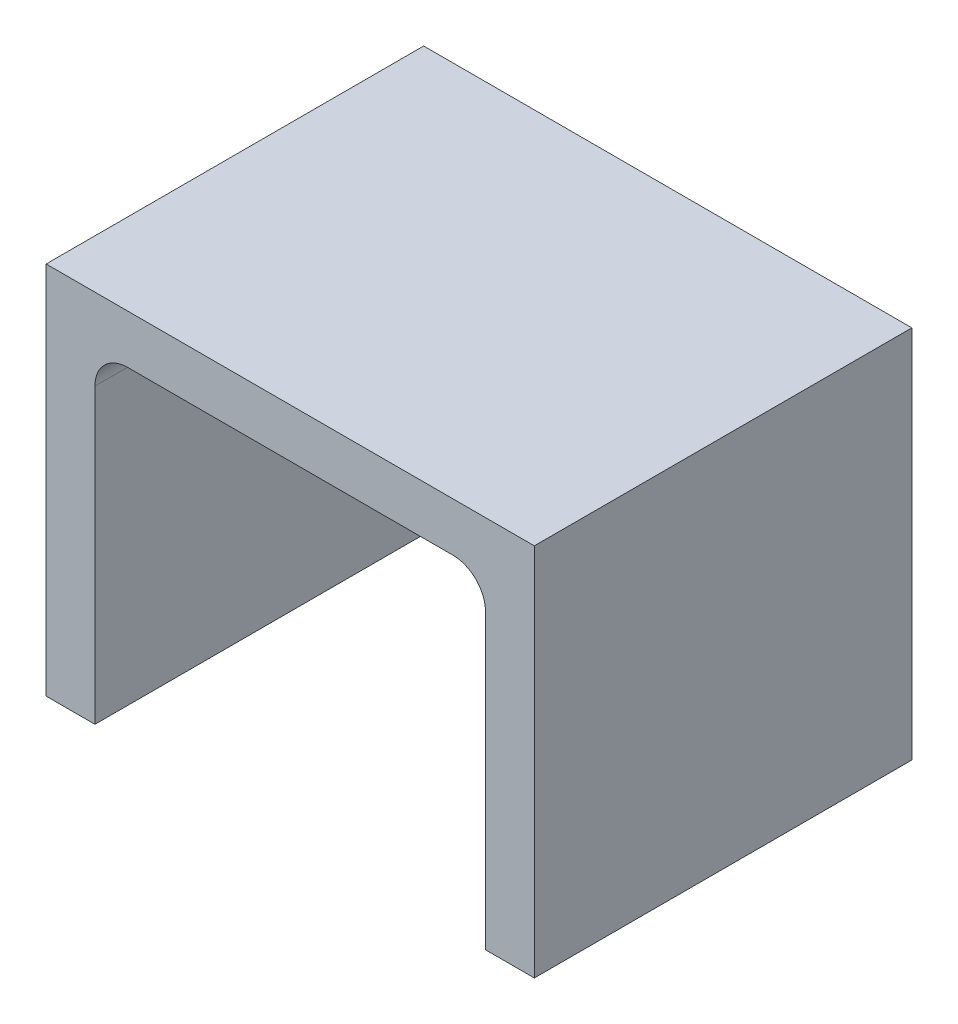
ISO-10303-21;
HEADER;
FILE_DESCRIPTION(('STEP AP214'),'2;1');
FILE_NAME('part.step','',(''),(''),'','','');
FILE_SCHEMA(('AUTOMOTIVE_DESIGN { 1 0 10303 214 1 1 1 1 }'));
ENDSEC;
DATA;
#1=APPLICATION_CONTEXT('core data for automotive mechanical design processes');
#2=APPLICATION_PROTOCOL_DEFINITION('international standard','automotive_design',2000,#1);
#3=PRODUCT_CONTEXT('',#1,'mechanical');
#4=PRODUCT('Part','Part','',(#3));
#5=PRODUCT_RELATED_PRODUCT_CATEGORY('part','',(#4));
#6=PRODUCT_DEFINITION_FORMATION('','',#4);
#7=PRODUCT_DEFINITION_CONTEXT('part definition',#1,'design');
#8=PRODUCT_DEFINITION('design','',#6,#7);
#9=PRODUCT_DEFINITION_SHAPE('','',#8);
#10=(LENGTH_UNIT() NAMED_UNIT(*) SI_UNIT(.MILLI.,.METRE.));
#11=(NAMED_UNIT(*) PLANE_ANGLE_UNIT() SI_UNIT($,.RADIAN.));
#12=(NAMED_UNIT(*) SI_UNIT($,.STERADIAN.) SOLID_ANGLE_UNIT());
#13=UNCERTAINTY_MEASURE_WITH_UNIT(LENGTH_MEASURE(1.E-05),#10,'distance_accuracy_value','');
#14=(GEOMETRIC_REPRESENTATION_CONTEXT(3) GLOBAL_UNCERTAINTY_ASSIGNED_CONTEXT((#13)) GLOBAL_UNIT_ASSIGNED_CONTEXT((#10,
#11,#12)) REPRESENTATION_CONTEXT('',''));
#15=CARTESIAN_POINT('',(0.,0.,0.));
#16=DIRECTION('',(0.,0.,1.));
#17=DIRECTION('',(1.,0.,0.));
#18=AXIS2_PLACEMENT_3D('',#15,#16,#17);
#19=CARTESIAN_POINT('',(0.,11.5,0.));
#20=DIRECTION('',(-1.,0.,0.));
#21=DIRECTION('',(0.,0.,1.));
#22=AXIS2_PLACEMENT_3D('',#19,#20,#21);
#23=PLANE('',#22);
#24=DIRECTION('',(0.,-1.,0.));
#25=VECTOR('',#24,1.);
#26=CARTESIAN_POINT('',(0.,10.,0.));
#27=LINE('',#26,#25);
#28=CARTESIAN_POINT('',(0.,11.5,0.));
#29=VERTEX_POINT('',#28);
#30=CARTESIAN_POINT('',(0.,0.,0.));
#31=VERTEX_POINT('',#30);
#32=EDGE_CURVE('E152',#29,#31,#27,.T.);
#33=ORIENTED_EDGE('',*,*,#32,.T.);
#34=DIRECTION('',(0.,0.,-1.));
#35=VECTOR('',#34,1.);
#36=CARTESIAN_POINT('',(0.,0.,17.));
#37=LINE('',#36,#35);
#38=CARTESIAN_POINT('',(0.,0.,11.6));
#39=VERTEX_POINT('',#38);
#40=EDGE_CURVE('E255',#39,#31,#37,.T.);
#41=ORIENTED_EDGE('',*,*,#40,.F.);
#42=DIRECTION('',(0.,-1.,0.));
#43=VECTOR('',#42,1.);
#44=CARTESIAN_POINT('',(0.,10.,11.6));
#45=LINE('',#44,#43);
#46=CARTESIAN_POINT('',(0.,11.5,11.6));
#47=VERTEX_POINT('',#46);
#48=EDGE_CURVE('E284',#47,#39,#45,.T.);
#49=ORIENTED_EDGE('',*,*,#48,.F.);
#50=DIRECTION('',(0.,0.,-1.));
#51=VECTOR('',#50,1.);
#52=CARTESIAN_POINT('',(0.,11.5,17.));
#53=LINE('',#52,#51);
#54=EDGE_CURVE('E267',#47,#29,#53,.T.);
#55=ORIENTED_EDGE('',*,*,#54,.T.);
#56=EDGE_LOOP('',(#33,#41,#49,#55));
#57=FACE_BOUND('',#56,.T.);
#58=ADVANCED_FACE('F38',(#57),#23,.T.);
#59=CARTESIAN_POINT('',(15.,3.,8.5));
#60=DIRECTION('',(1.,0.,0.));
#61=DIRECTION('',(0.,0.,-1.));
#62=AXIS2_PLACEMENT_3D('',#59,#60,#61);
#63=PLANE('',#62);
#64=DIRECTION('',(0.,0.,-1.));
#65=VECTOR('',#64,1.);
#66=CARTESIAN_POINT('',(15.,0.,17.));
#67=LINE('',#66,#65);
#68=CARTESIAN_POINT('',(15.,0.,11.6));
#69=VERTEX_POINT('',#68);
#70=CARTESIAN_POINT('',(15.,0.,0.));
#71=VERTEX_POINT('',#70);
#72=EDGE_CURVE('E259',#69,#71,#67,.T.);
#73=ORIENTED_EDGE('',*,*,#72,.T.);
#74=DIRECTION('',(0.,1.,0.));
#75=VECTOR('',#74,1.);
#76=CARTESIAN_POINT('',(15.,11.5,0.));
#77=LINE('',#76,#75);
#78=CARTESIAN_POINT('',(15.,11.5,0.));
#79=VERTEX_POINT('',#78);
#80=EDGE_CURVE('E128',#71,#79,#77,.T.);
#81=ORIENTED_EDGE('',*,*,#80,.T.);
#82=DIRECTION('',(0.,0.,-1.));
#83=VECTOR('',#82,1.);
#84=CARTESIAN_POINT('',(15.,11.5,17.));
#85=LINE('',#84,#83);
#86=CARTESIAN_POINT('',(15.,11.5,11.6));
#87=VERTEX_POINT('',#86);
#88=EDGE_CURVE('E258',#87,#79,#85,.T.);
#89=ORIENTED_EDGE('',*,*,#88,.F.);
#90=DIRECTION('',(0.,1.,0.));
#91=VECTOR('',#90,1.);
#92=CARTESIAN_POINT('',(15.,11.5,11.6));
#93=LINE('',#92,#91);
#94=EDGE_CURVE('E271',#69,#87,#93,.T.);
#95=ORIENTED_EDGE('',*,*,#94,.F.);
#96=EDGE_LOOP('',(#73,#81,#89,#95));
#97=FACE_BOUND('',#96,.T.);
#98=ADVANCED_FACE('F292',(#97),#63,.T.);
#99=CARTESIAN_POINT('',(15.,9.6,-7.65));
#100=DIRECTION('',(0.,1.,0.));
#101=DIRECTION('',(0.,0.,1.));
#102=AXIS2_PLACEMENT_3D('',#99,#100,#101);
#103=PLANE('',#102);
#104=DIRECTION('',(1.,0.,0.));
#105=VECTOR('',#104,1.);
#106=CARTESIAN_POINT('',(15.,9.6,3.2));
#107=LINE('',#106,#105);
#108=CARTESIAN_POINT('',(1.9,9.6,3.2));
#109=VERTEX_POINT('',#108);
#110=CARTESIAN_POINT('',(4.5,9.6,3.2));
#111=VERTEX_POINT('',#110);
#112=EDGE_CURVE('E193',#109,#111,#107,.T.);
#113=ORIENTED_EDGE('',*,*,#112,.F.);
#114=DIRECTION('',(0.,0.,-1.));
#115=VECTOR('',#114,1.);
#116=CARTESIAN_POINT('',(1.9,9.6,1.35));
#117=LINE('',#116,#115);
#118=CARTESIAN_POINT('',(1.9,9.6,1.5));
#119=VERTEX_POINT('',#118);
#120=EDGE_CURVE('E184',#109,#119,#117,.T.);
#121=ORIENTED_EDGE('',*,*,#120,.T.);
#122=DIRECTION('',(-1.,0.,0.));
#123=VECTOR('',#122,1.);
#124=CARTESIAN_POINT('',(15.,9.6,1.5));
#125=LINE('',#124,#123);
#126=CARTESIAN_POINT('',(4.5,9.6,1.5));
#127=VERTEX_POINT('',#126);
#128=EDGE_CURVE('E192',#127,#119,#125,.T.);
#129=ORIENTED_EDGE('',*,*,#128,.F.);
#130=DIRECTION('',(0.,0.,-1.));
#131=VECTOR('',#130,1.);
#132=CARTESIAN_POINT('',(4.5,9.6,3.35));
#133=LINE('',#132,#131);
#134=EDGE_CURVE('E189',#111,#127,#133,.T.);
#135=ORIENTED_EDGE('',*,*,#134,.F.);
#136=EDGE_LOOP('',(#113,#121,#129,#135));
#137=FACE_BOUND('',#136,.T.);
#138=ADVANCED_FACE('F451',(#137),#103,.F.);
#139=CARTESIAN_POINT('',(1.9,0.,-7.65));
#140=DIRECTION('',(1.,0.,0.));
#141=DIRECTION('',(0.,0.,1.));
#142=AXIS2_PLACEMENT_3D('',#139,#140,#141);
#143=PLANE('',#142);
#144=DIRECTION('',(0.,-1.,0.));
#145=VECTOR('',#144,1.);
#146=CARTESIAN_POINT('',(1.9,9.6,1.5));
#147=LINE('',#146,#145);
#148=CARTESIAN_POINT('',(1.9,7.5,1.5));
#149=VERTEX_POINT('',#148);
#150=EDGE_CURVE('E187',#119,#149,#147,.T.);
#151=ORIENTED_EDGE('',*,*,#150,.F.);
#152=ORIENTED_EDGE('',*,*,#120,.F.);
#153=DIRECTION('',(0.,1.,0.));
#154=VECTOR('',#153,1.);
#155=CARTESIAN_POINT('',(1.9,9.6,3.2));
#156=LINE('',#155,#154);
#157=CARTESIAN_POINT('',(1.9,7.5,3.2));
#158=VERTEX_POINT('',#157);
#159=EDGE_CURVE('E188',#158,#109,#156,.T.);
#160=ORIENTED_EDGE('',*,*,#159,.F.);
#161=DIRECTION('',(0.,0.,1.));
#162=VECTOR('',#161,1.);
#163=CARTESIAN_POINT('',(1.9,7.5,1.35));
#164=LINE('',#163,#162);
#165=EDGE_CURVE('E194',#149,#158,#164,.T.);
#166=ORIENTED_EDGE('',*,*,#165,.F.);
#167=EDGE_LOOP('',(#151,#152,#160,#166));
#168=FACE_BOUND('',#167,.T.);
#169=ADVANCED_FACE('F453',(#168),#143,.T.);
#170=CARTESIAN_POINT('',(15.,9.6,-7.65));
#171=DIRECTION('',(0.,1.,0.));
#172=DIRECTION('',(0.,0.,1.));
#173=AXIS2_PLACEMENT_3D('',#170,#171,#172);
#174=PLANE('',#173);
#175=DIRECTION('',(1.,0.,0.));
#176=VECTOR('',#175,1.);
#177=CARTESIAN_POINT('',(1.5,9.6,8.35));
#178=LINE('',#177,#176);
#179=CARTESIAN_POINT('',(1.9,9.6,8.35));
#180=VERTEX_POINT('',#179);
#181=CARTESIAN_POINT('',(4.5,9.6,8.35));
#182=VERTEX_POINT('',#181);
#183=EDGE_CURVE('E225',#180,#182,#178,.T.);
#184=ORIENTED_EDGE('',*,*,#183,.F.);
#185=DIRECTION('',(0.,0.,-1.));
#186=VECTOR('',#185,1.);
#187=CARTESIAN_POINT('',(1.9,9.6,4.35));
#188=LINE('',#187,#186);
#189=CARTESIAN_POINT('',(1.9,9.6,4.35));
#190=VERTEX_POINT('',#189);
#191=EDGE_CURVE('E216',#180,#190,#188,.T.);
#192=ORIENTED_EDGE('',*,*,#191,.T.);
#193=DIRECTION('',(-1.,0.,0.));
#194=VECTOR('',#193,1.);
#195=CARTESIAN_POINT('',(1.5,9.6,4.35));
#196=LINE('',#195,#194);
#197=CARTESIAN_POINT('',(4.5,9.6,4.35));
#198=VERTEX_POINT('',#197);
#199=EDGE_CURVE('E209',#198,#190,#196,.T.);
#200=ORIENTED_EDGE('',*,*,#199,.F.);
#201=DIRECTION('',(0.,0.,-1.));
#202=VECTOR('',#201,1.);
#203=CARTESIAN_POINT('',(4.5,9.6,8.35));
#204=LINE('',#203,#202);
#205=EDGE_CURVE('E213',#182,#198,#204,.T.);
#206=ORIENTED_EDGE('',*,*,#205,.F.);
#207=EDGE_LOOP('',(#184,#192,#200,#206));
#208=FACE_BOUND('',#207,.T.);
#209=ADVANCED_FACE('F437',(#208),#174,.F.);
#210=CARTESIAN_POINT('',(1.9,0.,-7.65));
#211=DIRECTION('',(1.,0.,0.));
#212=DIRECTION('',(0.,0.,1.));
#213=AXIS2_PLACEMENT_3D('',#210,#211,#212);
#214=PLANE('',#213);
#215=DIRECTION('',(0.,-1.,0.));
#216=VECTOR('',#215,1.);
#217=CARTESIAN_POINT('',(1.9,9.6,4.35));
#218=LINE('',#217,#216);
#219=CARTESIAN_POINT('',(1.9,7.5,4.35));
#220=VERTEX_POINT('',#219);
#221=EDGE_CURVE('E48',#190,#220,#218,.T.);
#222=ORIENTED_EDGE('',*,*,#221,.F.);
#223=ORIENTED_EDGE('',*,*,#191,.F.);
#224=DIRECTION('',(0.,1.,0.));
#225=VECTOR('',#224,1.);
#226=CARTESIAN_POINT('',(1.9,9.6,8.35));
#227=LINE('',#226,#225);
#228=CARTESIAN_POINT('',(1.9,7.5,8.35));
#229=VERTEX_POINT('',#228);
#230=EDGE_CURVE('E229',#229,#180,#227,.T.);
#231=ORIENTED_EDGE('',*,*,#230,.F.);
#232=DIRECTION('',(0.,0.,1.));
#233=VECTOR('',#232,1.);
#234=CARTESIAN_POINT('',(1.9,7.5,4.35));
#235=LINE('',#234,#233);
#236=EDGE_CURVE('E220',#220,#229,#235,.T.);
#237=ORIENTED_EDGE('',*,*,#236,.F.);
#238=EDGE_LOOP('',(#222,#223,#231,#237));
#239=FACE_BOUND('',#238,.T.);
#240=ADVANCED_FACE('F435',(#239),#214,.T.);
#241=CARTESIAN_POINT('',(1.9,7.5,4.35));
#242=DIRECTION('',(0.,-1.,0.));
#243=DIRECTION('',(0.,0.,-1.));
#244=AXIS2_PLACEMENT_3D('',#241,#242,#243);
#245=PLANE('',#244);
#246=DIRECTION('',(0.,0.,1.));
#247=VECTOR('',#246,1.);
#248=CARTESIAN_POINT('',(1.5,7.5,4.35));
#249=LINE('',#248,#247);
#250=CARTESIAN_POINT('',(1.5,7.5,4.35));
#251=VERTEX_POINT('',#250);
#252=CARTESIAN_POINT('',(1.5,7.5,8.35));
#253=VERTEX_POINT('',#252);
#254=EDGE_CURVE('E12',#251,#253,#249,.T.);
#255=ORIENTED_EDGE('',*,*,#254,.F.);
#256=DIRECTION('',(-1.,0.,0.));
#257=VECTOR('',#256,1.);
#258=CARTESIAN_POINT('',(1.9,7.5,4.35));
#259=LINE('',#258,#257);
#260=EDGE_CURVE('E217',#220,#251,#259,.T.);
#261=ORIENTED_EDGE('',*,*,#260,.F.);
#262=ORIENTED_EDGE('',*,*,#236,.T.);
#263=DIRECTION('',(-1.,0.,0.));
#264=VECTOR('',#263,1.);
#265=CARTESIAN_POINT('',(1.9,7.5,8.35));
#266=LINE('',#265,#264);
#267=EDGE_CURVE('E204',#229,#253,#266,.T.);
#268=ORIENTED_EDGE('',*,*,#267,.T.);
#269=EDGE_LOOP('',(#255,#261,#262,#268));
#270=FACE_BOUND('',#269,.T.);
#271=ADVANCED_FACE('F429',(#270),#245,.T.);
#272=CARTESIAN_POINT('',(1.9,7.5,1.35));
#273=DIRECTION('',(0.,-1.,0.));
#274=DIRECTION('',(0.,0.,-1.));
#275=AXIS2_PLACEMENT_3D('',#272,#273,#274);
#276=PLANE('',#275);
#277=DIRECTION('',(0.,0.,1.));
#278=VECTOR('',#277,1.);
#279=CARTESIAN_POINT('',(1.5,7.5,1.35));
#280=LINE('',#279,#278);
#281=CARTESIAN_POINT('',(1.5,7.5,1.5));
#282=VERTEX_POINT('',#281);
#283=CARTESIAN_POINT('',(1.5,7.5,3.2));
#284=VERTEX_POINT('',#283);
#285=EDGE_CURVE('E201',#282,#284,#280,.T.);
#286=ORIENTED_EDGE('',*,*,#285,.F.);
#287=DIRECTION('',(-1.,0.,0.));
#288=VECTOR('',#287,1.);
#289=CARTESIAN_POINT('',(1.5,7.5,1.5));
#290=LINE('',#289,#288);
#291=EDGE_CURVE('E197',#149,#282,#290,.T.);
#292=ORIENTED_EDGE('',*,*,#291,.F.);
#293=ORIENTED_EDGE('',*,*,#165,.T.);
#294=DIRECTION('',(-1.,0.,0.));
#295=VECTOR('',#294,1.);
#296=CARTESIAN_POINT('',(1.9,7.5,3.2));
#297=LINE('',#296,#295);
#298=EDGE_CURVE('E394',#158,#284,#297,.T.);
#299=ORIENTED_EDGE('',*,*,#298,.T.);
#300=EDGE_LOOP('',(#286,#292,#293,#299));
#301=FACE_BOUND('',#300,.T.);
#302=ADVANCED_FACE('F511',(#301),#276,.T.);
#303=CARTESIAN_POINT('',(1.5,9.6,1.5));
#304=DIRECTION('',(0.,0.,-1.));
#305=DIRECTION('',(-1.,0.,0.));
#306=AXIS2_PLACEMENT_3D('',#303,#304,#305);
#307=PLANE('',#306);
#308=DIRECTION('',(-1.,0.,0.));
#309=VECTOR('',#308,1.);
#310=CARTESIAN_POINT('',(13.5,10.,1.5));
#311=LINE('',#310,#309);
#312=CARTESIAN_POINT('',(4.5,10.,1.5));
#313=VERTEX_POINT('',#312);
#314=CARTESIAN_POINT('',(1.5,10.,1.5));
#315=VERTEX_POINT('',#314);
#316=EDGE_CURVE('E175',#313,#315,#311,.T.);
#317=ORIENTED_EDGE('',*,*,#316,.F.);
#318=DIRECTION('',(0.,1.,0.));
#319=VECTOR('',#318,1.);
#320=CARTESIAN_POINT('',(4.5,9.6,1.5));
#321=LINE('',#320,#319);
#322=EDGE_CURVE('E396',#127,#313,#321,.T.);
#323=ORIENTED_EDGE('',*,*,#322,.F.);
#324=ORIENTED_EDGE('',*,*,#128,.T.);
#325=ORIENTED_EDGE('',*,*,#150,.T.);
#326=ORIENTED_EDGE('',*,*,#291,.T.);
#327=DIRECTION('',(0.,1.,0.));
#328=VECTOR('',#327,1.);
#329=CARTESIAN_POINT('',(1.5,9.6,1.5));
#330=LINE('',#329,#328);
#331=EDGE_CURVE('E238',#282,#315,#330,.T.);
#332=ORIENTED_EDGE('',*,*,#331,.T.);
#333=EDGE_LOOP('',(#317,#323,#324,#325,#326,#332));
#334=FACE_BOUND('',#333,.T.);
#335=ADVANCED_FACE('F531',(#334),#307,.T.);
#336=CARTESIAN_POINT('',(4.5,9.6,3.35));
#337=DIRECTION('',(1.,0.,0.));
#338=DIRECTION('',(0.,0.,-1.));
#339=AXIS2_PLACEMENT_3D('',#336,#337,#338);
#340=PLANE('',#339);
#341=DIRECTION('',(0.,0.,-1.));
#342=VECTOR('',#341,1.);
#343=CARTESIAN_POINT('',(4.5,10.,3.35));
#344=LINE('',#343,#342);
#345=CARTESIAN_POINT('',(4.5,10.,3.2));
#346=VERTEX_POINT('',#345);
#347=EDGE_CURVE('E198',#346,#313,#344,.T.);
#348=ORIENTED_EDGE('',*,*,#347,.F.);
#349=DIRECTION('',(0.,1.,0.));
#350=VECTOR('',#349,1.);
#351=CARTESIAN_POINT('',(4.5,9.6,3.2));
#352=LINE('',#351,#350);
#353=EDGE_CURVE('E404',#111,#346,#352,.T.);
#354=ORIENTED_EDGE('',*,*,#353,.F.);
#355=ORIENTED_EDGE('',*,*,#134,.T.);
#356=ORIENTED_EDGE('',*,*,#322,.T.);
#357=EDGE_LOOP('',(#348,#354,#355,#356));
#358=FACE_BOUND('',#357,.T.);
#359=ADVANCED_FACE('F465',(#358),#340,.T.);
#360=CARTESIAN_POINT('',(1.5,9.6,3.2));
#361=DIRECTION('',(0.,0.,1.));
#362=DIRECTION('',(1.,0.,0.));
#363=AXIS2_PLACEMENT_3D('',#360,#361,#362);
#364=PLANE('',#363);
#365=DIRECTION('',(1.,0.,0.));
#366=VECTOR('',#365,1.);
#367=CARTESIAN_POINT('',(13.5,10.,3.2));
#368=LINE('',#367,#366);
#369=CARTESIAN_POINT('',(1.5,10.,3.2));
#370=VERTEX_POINT('',#369);
#371=EDGE_CURVE('E200',#370,#346,#368,.T.);
#372=ORIENTED_EDGE('',*,*,#371,.F.);
#373=DIRECTION('',(0.,1.,0.));
#374=VECTOR('',#373,1.);
#375=CARTESIAN_POINT('',(1.5,0.,3.2));
#376=LINE('',#375,#374);
#377=EDGE_CURVE('E408',#284,#370,#376,.T.);
#378=ORIENTED_EDGE('',*,*,#377,.F.);
#379=ORIENTED_EDGE('',*,*,#298,.F.);
#380=ORIENTED_EDGE('',*,*,#159,.T.);
#381=ORIENTED_EDGE('',*,*,#112,.T.);
#382=ORIENTED_EDGE('',*,*,#353,.T.);
#383=EDGE_LOOP('',(#372,#378,#379,#380,#381,#382));
#384=FACE_BOUND('',#383,.T.);
#385=ADVANCED_FACE('F448',(#384),#364,.T.);
#386=CARTESIAN_POINT('',(1.5,9.6,4.35));
#387=DIRECTION('',(0.,0.,-1.));
#388=DIRECTION('',(-1.,0.,0.));
#389=AXIS2_PLACEMENT_3D('',#386,#387,#388);
#390=PLANE('',#389);
#391=DIRECTION('',(-1.,0.,0.));
#392=VECTOR('',#391,1.);
#393=CARTESIAN_POINT('',(1.5,10.,4.35));
#394=LINE('',#393,#392);
#395=CARTESIAN_POINT('',(4.5,10.,4.35));
#396=VERTEX_POINT('',#395);
#397=CARTESIAN_POINT('',(1.5,10.,4.35));
#398=VERTEX_POINT('',#397);
#399=EDGE_CURVE('E235',#396,#398,#394,.T.);
#400=ORIENTED_EDGE('',*,*,#399,.F.);
#401=DIRECTION('',(0.,1.,0.));
#402=VECTOR('',#401,1.);
#403=CARTESIAN_POINT('',(4.5,9.6,4.35));
#404=LINE('',#403,#402);
#405=EDGE_CURVE('E205',#198,#396,#404,.T.);
#406=ORIENTED_EDGE('',*,*,#405,.F.);
#407=ORIENTED_EDGE('',*,*,#199,.T.);
#408=ORIENTED_EDGE('',*,*,#221,.T.);
#409=ORIENTED_EDGE('',*,*,#260,.T.);
#410=DIRECTION('',(0.,1.,0.));
#411=VECTOR('',#410,1.);
#412=CARTESIAN_POINT('',(1.5,9.6,4.35));
#413=LINE('',#412,#411);
#414=EDGE_CURVE('E139',#251,#398,#413,.T.);
#415=ORIENTED_EDGE('',*,*,#414,.T.);
#416=EDGE_LOOP('',(#400,#406,#407,#408,#409,#415));
#417=FACE_BOUND('',#416,.T.);
#418=ADVANCED_FACE('F425',(#417),#390,.T.);
#419=CARTESIAN_POINT('',(4.5,9.6,8.35));
#420=DIRECTION('',(1.,0.,0.));
#421=DIRECTION('',(0.,0.,-1.));
#422=AXIS2_PLACEMENT_3D('',#419,#420,#421);
#423=PLANE('',#422);
#424=DIRECTION('',(0.,0.,-1.));
#425=VECTOR('',#424,1.);
#426=CARTESIAN_POINT('',(4.5,10.,8.35));
#427=LINE('',#426,#425);
#428=CARTESIAN_POINT('',(4.5,10.,8.35));
#429=VERTEX_POINT('',#428);
#430=EDGE_CURVE('E239',#429,#396,#427,.T.);
#431=ORIENTED_EDGE('',*,*,#430,.F.);
#432=DIRECTION('',(0.,1.,0.));
#433=VECTOR('',#432,1.);
#434=CARTESIAN_POINT('',(4.5,9.6,8.35));
#435=LINE('',#434,#433);
#436=EDGE_CURVE('E208',#182,#429,#435,.T.);
#437=ORIENTED_EDGE('',*,*,#436,.F.);
#438=ORIENTED_EDGE('',*,*,#205,.T.);
#439=ORIENTED_EDGE('',*,*,#405,.T.);
#440=EDGE_LOOP('',(#431,#437,#438,#439));
#441=FACE_BOUND('',#440,.T.);
#442=ADVANCED_FACE('F439',(#441),#423,.T.);
#443=CARTESIAN_POINT('',(1.5,9.6,8.35));
#444=DIRECTION('',(0.,0.,1.));
#445=DIRECTION('',(1.,0.,0.));
#446=AXIS2_PLACEMENT_3D('',#443,#444,#445);
#447=PLANE('',#446);
#448=DIRECTION('',(1.,0.,0.));
#449=VECTOR('',#448,1.);
#450=CARTESIAN_POINT('',(1.5,10.,8.35));
#451=LINE('',#450,#449);
#452=CARTESIAN_POINT('',(1.5,10.,8.35));
#453=VERTEX_POINT('',#452);
#454=EDGE_CURVE('E212',#453,#429,#451,.T.);
#455=ORIENTED_EDGE('',*,*,#454,.F.);
#456=DIRECTION('',(0.,1.,0.));
#457=VECTOR('',#456,1.);
#458=CARTESIAN_POINT('',(1.5,9.6,8.35));
#459=LINE('',#458,#457);
#460=EDGE_CURVE('E57',#253,#453,#459,.T.);
#461=ORIENTED_EDGE('',*,*,#460,.F.);
#462=ORIENTED_EDGE('',*,*,#267,.F.);
#463=ORIENTED_EDGE('',*,*,#230,.T.);
#464=ORIENTED_EDGE('',*,*,#183,.T.);
#465=ORIENTED_EDGE('',*,*,#436,.T.);
#466=EDGE_LOOP('',(#455,#461,#462,#463,#464,#465));
#467=FACE_BOUND('',#466,.T.);
#468=ADVANCED_FACE('F432',(#467),#447,.T.);
#469=CARTESIAN_POINT('',(20.81,13.9309085869001,9.85367487826033));
#470=DIRECTION('',(0.,0.,-1.));
#471=DIRECTION('',(0.,1.,0.));
#472=AXIS2_PLACEMENT_3D('',#469,#470,#471);
#473=PLANE('',#472);
#474=DIRECTION('',(0.,-1.,0.));
#475=VECTOR('',#474,1.);
#476=CARTESIAN_POINT('',(1.5,0.,9.85367487826033));
#477=LINE('',#476,#475);
#478=CARTESIAN_POINT('',(1.5,10.,9.85367487826033));
#479=VERTEX_POINT('',#478);
#480=CARTESIAN_POINT('',(1.5,9.,9.85367487826033));
#481=VERTEX_POINT('',#480);
#482=EDGE_CURVE('E252',#479,#481,#477,.T.);
#483=ORIENTED_EDGE('',*,*,#482,.F.);
#484=DIRECTION('',(-1.,0.,0.));
#485=VECTOR('',#484,1.);
#486=CARTESIAN_POINT('',(13.5,10.,9.85367487826033));
#487=LINE('',#486,#485);
#488=CARTESIAN_POINT('',(2.5,10.,9.85367487826033));
#489=VERTEX_POINT('',#488);
#490=EDGE_CURVE('E248',#489,#479,#487,.T.);
#491=ORIENTED_EDGE('',*,*,#490,.F.);
#492=CARTESIAN_POINT('',(2.5,9.,9.85367487826033));
#493=DIRECTION('',(0.,0.,-1.));
#494=DIRECTION('',(0.,1.,0.));
#495=AXIS2_PLACEMENT_3D('',#492,#493,#494);
#496=CIRCLE('',#495,1.);
#497=EDGE_CURVE('E378',#489,#481,#496,.F.);
#498=ORIENTED_EDGE('',*,*,#497,.T.);
#499=EDGE_LOOP('',(#483,#491,#498));
#500=FACE_BOUND('',#499,.T.);
#501=ADVANCED_FACE('F446',(#500),#473,.T.);
#502=CARTESIAN_POINT('',(13.5,10.,9.85367487826033));
#503=VERTEX_POINT('',#502);
#504=CARTESIAN_POINT('',(12.5,10.,9.85367487826033));
#505=VERTEX_POINT('',#504);
#506=EDGE_CURVE('E249',#503,#505,#487,.T.);
#507=ORIENTED_EDGE('',*,*,#506,.F.);
#508=DIRECTION('',(0.,1.,0.));
#509=VECTOR('',#508,1.);
#510=CARTESIAN_POINT('',(13.5,0.,9.85367487826033));
#511=LINE('',#510,#509);
#512=CARTESIAN_POINT('',(13.5,9.,9.85367487826033));
#513=VERTEX_POINT('',#512);
#514=EDGE_CURVE('E245',#513,#503,#511,.T.);
#515=ORIENTED_EDGE('',*,*,#514,.F.);
#516=CARTESIAN_POINT('',(12.5,9.,9.85367487826033));
#517=DIRECTION('',(0.,0.,-1.));
#518=DIRECTION('',(0.,1.,0.));
#519=AXIS2_PLACEMENT_3D('',#516,#517,#518);
#520=CIRCLE('',#519,1.);
#521=EDGE_CURVE('E377',#513,#505,#520,.F.);
#522=ORIENTED_EDGE('',*,*,#521,.T.);
#523=EDGE_LOOP('',(#507,#515,#522));
#524=FACE_BOUND('',#523,.T.);
#525=ADVANCED_FACE('F494',(#524),#473,.T.);
#526=CARTESIAN_POINT('',(12.5,9.,17.));
#527=DIRECTION('',(0.,0.,1.));
#528=DIRECTION('',(1.,0.,0.));
#529=AXIS2_PLACEMENT_3D('',#526,#527,#528);
#530=CYLINDRICAL_SURFACE('',#529,1.);
#531=CARTESIAN_POINT('',(12.5,9.,11.6));
#532=DIRECTION('',(0.,0.,1.));
#533=DIRECTION('',(1.,0.,0.));
#534=AXIS2_PLACEMENT_3D('',#531,#532,#533);
#535=CIRCLE('',#534,1.);
#536=CARTESIAN_POINT('',(12.5,10.,11.6));
#537=VERTEX_POINT('',#536);
#538=CARTESIAN_POINT('',(13.5,9.,11.6));
#539=VERTEX_POINT('',#538);
#540=EDGE_CURVE('E371',#537,#539,#535,.F.);
#541=ORIENTED_EDGE('',*,*,#540,.F.);
#542=DIRECTION('',(0.,0.,-1.));
#543=VECTOR('',#542,1.);
#544=CARTESIAN_POINT('',(12.5,10.,11.6));
#545=LINE('',#544,#543);
#546=EDGE_CURVE('E384',#505,#537,#545,.F.);
#547=ORIENTED_EDGE('',*,*,#546,.F.);
#548=ORIENTED_EDGE('',*,*,#521,.F.);
#549=DIRECTION('',(0.,0.,-1.));
#550=VECTOR('',#549,1.);
#551=CARTESIAN_POINT('',(13.5,9.,9.85367487826033));
#552=LINE('',#551,#550);
#553=EDGE_CURVE('E272',#539,#513,#552,.T.);
#554=ORIENTED_EDGE('',*,*,#553,.F.);
#555=EDGE_LOOP('',(#541,#547,#548,#554));
#556=FACE_BOUND('',#555,.T.);
#557=ADVANCED_FACE('F382',(#556),#530,.F.);
#558=CARTESIAN_POINT('',(2.5,9.,17.));
#559=DIRECTION('',(0.,0.,1.));
#560=DIRECTION('',(1.,0.,0.));
#561=AXIS2_PLACEMENT_3D('',#558,#559,#560);
#562=CYLINDRICAL_SURFACE('',#561,1.);
#563=CARTESIAN_POINT('',(2.5,9.,11.6));
#564=DIRECTION('',(0.,0.,1.));
#565=DIRECTION('',(1.,0.,0.));
#566=AXIS2_PLACEMENT_3D('',#563,#564,#565);
#567=CIRCLE('',#566,1.);
#568=CARTESIAN_POINT('',(1.5,9.,11.6));
#569=VERTEX_POINT('',#568);
#570=CARTESIAN_POINT('',(2.5,10.,11.6));
#571=VERTEX_POINT('',#570);
#572=EDGE_CURVE('E247',#569,#571,#567,.F.);
#573=ORIENTED_EDGE('',*,*,#572,.F.);
#574=DIRECTION('',(0.,0.,-1.));
#575=VECTOR('',#574,1.);
#576=CARTESIAN_POINT('',(1.5,9.,11.6));
#577=LINE('',#576,#575);
#578=EDGE_CURVE('E388',#481,#569,#577,.F.);
#579=ORIENTED_EDGE('',*,*,#578,.F.);
#580=ORIENTED_EDGE('',*,*,#497,.F.);
#581=DIRECTION('',(0.,0.,-1.));
#582=VECTOR('',#581,1.);
#583=CARTESIAN_POINT('',(2.5,10.,9.85367487826033));
#584=LINE('',#583,#582);
#585=EDGE_CURVE('E383',#571,#489,#584,.T.);
#586=ORIENTED_EDGE('',*,*,#585,.F.);
#587=EDGE_LOOP('',(#573,#579,#580,#586));
#588=FACE_BOUND('',#587,.T.);
#589=ADVANCED_FACE('F491',(#588),#562,.F.);
#590=CARTESIAN_POINT('',(1.5,0.,17.));
#591=DIRECTION('',(-1.,0.,0.));
#592=DIRECTION('',(0.,0.,1.));
#593=AXIS2_PLACEMENT_3D('',#590,#591,#592);
#594=PLANE('',#593);
#595=DIRECTION('',(0.,1.,0.));
#596=VECTOR('',#595,1.);
#597=CARTESIAN_POINT('',(1.5,0.,11.6));
#598=LINE('',#597,#596);
#599=CARTESIAN_POINT('',(1.5,0.,11.6));
#600=VERTEX_POINT('',#599);
#601=EDGE_CURVE('E281',#600,#569,#598,.T.);
#602=ORIENTED_EDGE('',*,*,#601,.F.);
#603=DIRECTION('',(0.,0.,-1.));
#604=VECTOR('',#603,1.);
#605=CARTESIAN_POINT('',(1.5,0.,17.));
#606=LINE('',#605,#604);
#607=CARTESIAN_POINT('',(1.5,0.,0.));
#608=VERTEX_POINT('',#607);
#609=EDGE_CURVE('E144',#600,#608,#606,.T.);
#610=ORIENTED_EDGE('',*,*,#609,.T.);
#611=DIRECTION('',(0.,1.,0.));
#612=VECTOR('',#611,1.);
#613=CARTESIAN_POINT('',(1.5,0.,0.));
#614=LINE('',#613,#612);
#615=CARTESIAN_POINT('',(1.5,10.,0.));
#616=VERTEX_POINT('',#615);
#617=EDGE_CURVE('E159',#608,#616,#614,.T.);
#618=ORIENTED_EDGE('',*,*,#617,.T.);
#619=DIRECTION('',(0.,0.,-1.));
#620=VECTOR('',#619,1.);
#621=CARTESIAN_POINT('',(1.5,10.,17.));
#622=LINE('',#621,#620);
#623=EDGE_CURVE('E148',#315,#616,#622,.T.);
#624=ORIENTED_EDGE('',*,*,#623,.F.);
#625=ORIENTED_EDGE('',*,*,#331,.F.);
#626=ORIENTED_EDGE('',*,*,#285,.T.);
#627=ORIENTED_EDGE('',*,*,#377,.T.);
#628=EDGE_CURVE('E162',#398,#370,#622,.T.);
#629=ORIENTED_EDGE('',*,*,#628,.F.);
#630=ORIENTED_EDGE('',*,*,#414,.F.);
#631=ORIENTED_EDGE('',*,*,#254,.T.);
#632=ORIENTED_EDGE('',*,*,#460,.T.);
#633=EDGE_CURVE('E160',#479,#453,#622,.T.);
#634=ORIENTED_EDGE('',*,*,#633,.F.);
#635=ORIENTED_EDGE('',*,*,#482,.T.);
#636=ORIENTED_EDGE('',*,*,#578,.T.);
#637=EDGE_LOOP('',(#602,#610,#618,#624,#625,#626,#627,#629,#630,#631,#632,#634,#635,#636));
#638=FACE_BOUND('',#637,.T.);
#639=ADVANCED_FACE('F180',(#638),#594,.F.);
#640=CARTESIAN_POINT('',(13.5,10.,17.));
#641=DIRECTION('',(0.,1.,0.));
#642=DIRECTION('',(0.,0.,1.));
#643=AXIS2_PLACEMENT_3D('',#640,#641,#642);
#644=PLANE('',#643);
#645=ORIENTED_EDGE('',*,*,#585,.T.);
#646=ORIENTED_EDGE('',*,*,#490,.T.);
#647=ORIENTED_EDGE('',*,*,#633,.T.);
#648=ORIENTED_EDGE('',*,*,#454,.T.);
#649=ORIENTED_EDGE('',*,*,#430,.T.);
#650=ORIENTED_EDGE('',*,*,#399,.T.);
#651=ORIENTED_EDGE('',*,*,#628,.T.);
#652=ORIENTED_EDGE('',*,*,#371,.T.);
#653=ORIENTED_EDGE('',*,*,#347,.T.);
#654=ORIENTED_EDGE('',*,*,#316,.T.);
#655=ORIENTED_EDGE('',*,*,#623,.T.);
#656=DIRECTION('',(1.,0.,0.));
#657=VECTOR('',#656,1.);
#658=CARTESIAN_POINT('',(13.5,10.,0.));
#659=LINE('',#658,#657);
#660=CARTESIAN_POINT('',(13.5,10.,0.));
#661=VERTEX_POINT('',#660);
#662=EDGE_CURVE('E127',#616,#661,#659,.T.);
#663=ORIENTED_EDGE('',*,*,#662,.T.);
#664=DIRECTION('',(0.,0.,-1.));
#665=VECTOR('',#664,1.);
#666=CARTESIAN_POINT('',(13.5,10.,17.));
#667=LINE('',#666,#665);
#668=EDGE_CURVE('E122',#503,#661,#667,.T.);
#669=ORIENTED_EDGE('',*,*,#668,.F.);
#670=ORIENTED_EDGE('',*,*,#506,.T.);
#671=ORIENTED_EDGE('',*,*,#546,.T.);
#672=DIRECTION('',(1.,0.,0.));
#673=VECTOR('',#672,1.);
#674=CARTESIAN_POINT('',(13.5,10.,11.6));
#675=LINE('',#674,#673);
#676=EDGE_CURVE('E278',#571,#537,#675,.T.);
#677=ORIENTED_EDGE('',*,*,#676,.F.);
#678=EDGE_LOOP('',(#645,#646,#647,#648,#649,#650,#651,#652,#653,#654,#655,#663,#669,#670,#671,#677));
#679=FACE_BOUND('',#678,.T.);
#680=ADVANCED_FACE('F171',(#679),#644,.F.);
#681=CARTESIAN_POINT('',(13.5,0.,17.));
#682=DIRECTION('',(1.,0.,0.));
#683=DIRECTION('',(0.,0.,-1.));
#684=AXIS2_PLACEMENT_3D('',#681,#682,#683);
#685=PLANE('',#684);
#686=DIRECTION('',(0.,0.,-1.));
#687=VECTOR('',#686,1.);
#688=CARTESIAN_POINT('',(13.5,0.,17.));
#689=LINE('',#688,#687);
#690=CARTESIAN_POINT('',(13.5,0.,11.6));
#691=VERTEX_POINT('',#690);
#692=CARTESIAN_POINT('',(13.5,0.,0.));
#693=VERTEX_POINT('',#692);
#694=EDGE_CURVE('E118',#691,#693,#689,.T.);
#695=ORIENTED_EDGE('',*,*,#694,.F.);
#696=DIRECTION('',(0.,-1.,0.));
#697=VECTOR('',#696,1.);
#698=CARTESIAN_POINT('',(13.5,0.,11.6));
#699=LINE('',#698,#697);
#700=EDGE_CURVE('E269',#539,#691,#699,.T.);
#701=ORIENTED_EDGE('',*,*,#700,.F.);
#702=ORIENTED_EDGE('',*,*,#553,.T.);
#703=ORIENTED_EDGE('',*,*,#514,.T.);
#704=ORIENTED_EDGE('',*,*,#668,.T.);
#705=DIRECTION('',(0.,-1.,0.));
#706=VECTOR('',#705,1.);
#707=CARTESIAN_POINT('',(13.5,0.,0.));
#708=LINE('',#707,#706);
#709=EDGE_CURVE('E113',#661,#693,#708,.T.);
#710=ORIENTED_EDGE('',*,*,#709,.T.);
#711=EDGE_LOOP('',(#695,#701,#702,#703,#704,#710));
#712=FACE_BOUND('',#711,.T.);
#713=ADVANCED_FACE('F115',(#712),#685,.F.);
#714=CARTESIAN_POINT('',(15.,0.,17.));
#715=DIRECTION('',(0.,1.,0.));
#716=DIRECTION('',(-1.,0.,0.));
#717=AXIS2_PLACEMENT_3D('',#714,#715,#716);
#718=PLANE('',#717);
#719=DIRECTION('',(1.,0.,0.));
#720=VECTOR('',#719,1.);
#721=CARTESIAN_POINT('',(15.,0.,11.6));
#722=LINE('',#721,#720);
#723=EDGE_CURVE('E138',#691,#69,#722,.T.);
#724=ORIENTED_EDGE('',*,*,#723,.F.);
#725=ORIENTED_EDGE('',*,*,#694,.T.);
#726=DIRECTION('',(1.,0.,0.));
#727=VECTOR('',#726,1.);
#728=CARTESIAN_POINT('',(15.,0.,0.));
#729=LINE('',#728,#727);
#730=EDGE_CURVE('E136',#693,#71,#729,.T.);
#731=ORIENTED_EDGE('',*,*,#730,.T.);
#732=ORIENTED_EDGE('',*,*,#72,.F.);
#733=EDGE_LOOP('',(#724,#725,#731,#732));
#734=FACE_BOUND('',#733,.T.);
#735=ADVANCED_FACE('F133',(#734),#718,.F.);
#736=CARTESIAN_POINT('',(0.,11.5,17.));
#737=DIRECTION('',(0.,-1.,0.));
#738=DIRECTION('',(0.,0.,-1.));
#739=AXIS2_PLACEMENT_3D('',#736,#737,#738);
#740=PLANE('',#739);
#741=ORIENTED_EDGE('',*,*,#88,.T.);
#742=DIRECTION('',(-1.,0.,0.));
#743=VECTOR('',#742,1.);
#744=CARTESIAN_POINT('',(0.,11.5,0.));
#745=LINE('',#744,#743);
#746=EDGE_CURVE('E151',#79,#29,#745,.T.);
#747=ORIENTED_EDGE('',*,*,#746,.T.);
#748=ORIENTED_EDGE('',*,*,#54,.F.);
#749=DIRECTION('',(-1.,0.,0.));
#750=VECTOR('',#749,1.);
#751=CARTESIAN_POINT('',(0.,11.5,11.6));
#752=LINE('',#751,#750);
#753=EDGE_CURVE('E275',#87,#47,#752,.T.);
#754=ORIENTED_EDGE('',*,*,#753,.F.);
#755=EDGE_LOOP('',(#741,#747,#748,#754));
#756=FACE_BOUND('',#755,.T.);
#757=ADVANCED_FACE('F470',(#756),#740,.F.);
#758=CARTESIAN_POINT('',(0.,0.,17.));
#759=DIRECTION('',(0.,1.,0.));
#760=DIRECTION('',(0.,0.,1.));
#761=AXIS2_PLACEMENT_3D('',#758,#759,#760);
#762=PLANE('',#761);
#763=ORIENTED_EDGE('',*,*,#40,.T.);
#764=DIRECTION('',(1.,0.,0.));
#765=VECTOR('',#764,1.);
#766=CARTESIAN_POINT('',(0.,0.,0.));
#767=LINE('',#766,#765);
#768=EDGE_CURVE('E42',#31,#608,#767,.T.);
#769=ORIENTED_EDGE('',*,*,#768,.T.);
#770=ORIENTED_EDGE('',*,*,#609,.F.);
#771=DIRECTION('',(1.,0.,0.));
#772=VECTOR('',#771,1.);
#773=CARTESIAN_POINT('',(0.,0.,11.6));
#774=LINE('',#773,#772);
#775=EDGE_CURVE('E287',#39,#600,#774,.T.);
#776=ORIENTED_EDGE('',*,*,#775,.F.);
#777=EDGE_LOOP('',(#763,#769,#770,#776));
#778=FACE_BOUND('',#777,.T.);
#779=ADVANCED_FACE('F473',(#778),#762,.F.);
#780=CARTESIAN_POINT('',(0.,0.,0.));
#781=DIRECTION('',(0.,0.,-1.));
#782=DIRECTION('',(-1.,0.,0.));
#783=AXIS2_PLACEMENT_3D('',#780,#781,#782);
#784=PLANE('',#783);
#785=ORIENTED_EDGE('',*,*,#768,.F.);
#786=ORIENTED_EDGE('',*,*,#32,.F.);
#787=ORIENTED_EDGE('',*,*,#746,.F.);
#788=ORIENTED_EDGE('',*,*,#80,.F.);
#789=ORIENTED_EDGE('',*,*,#730,.F.);
#790=ORIENTED_EDGE('',*,*,#709,.F.);
#791=ORIENTED_EDGE('',*,*,#662,.F.);
#792=ORIENTED_EDGE('',*,*,#617,.F.);
#793=EDGE_LOOP('',(#785,#786,#787,#788,#789,#790,#791,#792));
#794=FACE_BOUND('',#793,.T.);
#795=ADVANCED_FACE('F40',(#794),#784,.T.);
#796=CARTESIAN_POINT('',(-43.8722892542492,13.7861771975233,11.6));
#797=DIRECTION('',(0.,0.,1.));
#798=DIRECTION('',(1.,0.,0.));
#799=AXIS2_PLACEMENT_3D('',#796,#797,#798);
#800=PLANE('',#799);
#801=ORIENTED_EDGE('',*,*,#48,.T.);
#802=ORIENTED_EDGE('',*,*,#775,.T.);
#803=ORIENTED_EDGE('',*,*,#601,.T.);
#804=ORIENTED_EDGE('',*,*,#572,.T.);
#805=ORIENTED_EDGE('',*,*,#676,.T.);
#806=ORIENTED_EDGE('',*,*,#540,.T.);
#807=ORIENTED_EDGE('',*,*,#700,.T.);
#808=ORIENTED_EDGE('',*,*,#723,.T.);
#809=ORIENTED_EDGE('',*,*,#94,.T.);
#810=ORIENTED_EDGE('',*,*,#753,.T.);
#811=EDGE_LOOP('',(#801,#802,#803,#804,#805,#806,#807,#808,#809,#810));
#812=FACE_BOUND('',#811,.T.);
#813=ADVANCED_FACE('F372',(#812),#800,.T.);
#814=CLOSED_SHELL('',(#58,#98,#138,#169,#209,#240,#271,#302,#335,#359,#385,#418,#442,#468,#501,
#525,#557,#589,#639,#680,#713,#735,#757,#779,#795,#813));
#815=MANIFOLD_SOLID_BREP('B2',#814);
#816=ADVANCED_BREP_SHAPE_REPRESENTATION('',(#18,#815),#14);
#817=SHAPE_DEFINITION_REPRESENTATION(#9,#816);
ENDSEC;
END-ISO-10303-21;
